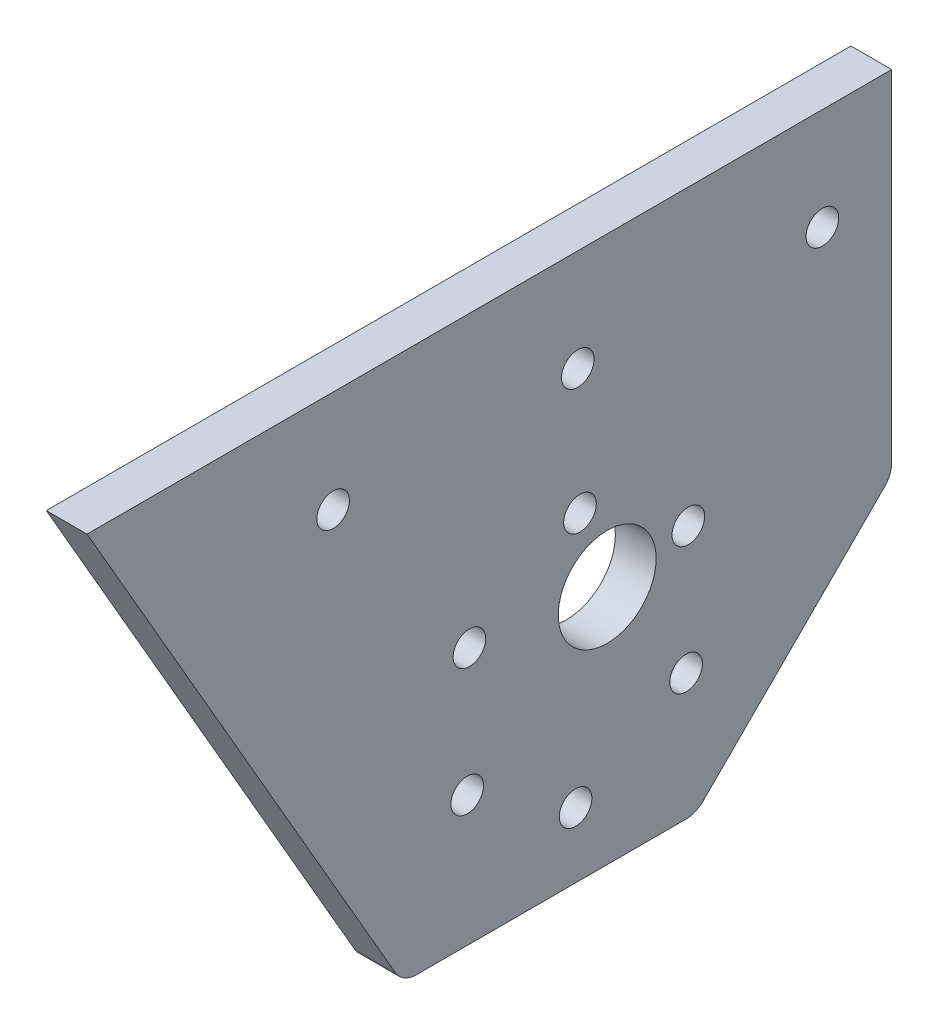
ISO-10303-21;
HEADER;
FILE_DESCRIPTION(('STEP AP214'),'2;1');
FILE_NAME('part.step','',(''),(''),'','','');
FILE_SCHEMA(('AUTOMOTIVE_DESIGN { 1 0 10303 214 1 1 1 1 }'));
ENDSEC;
DATA;
#1=APPLICATION_CONTEXT('core data for automotive mechanical design processes');
#2=APPLICATION_PROTOCOL_DEFINITION('international standard','automotive_design',2000,#1);
#3=PRODUCT_CONTEXT('',#1,'mechanical');
#4=PRODUCT('Part','Part','',(#3));
#5=PRODUCT_RELATED_PRODUCT_CATEGORY('part','',(#4));
#6=PRODUCT_DEFINITION_FORMATION('','',#4);
#7=PRODUCT_DEFINITION_CONTEXT('part definition',#1,'design');
#8=PRODUCT_DEFINITION('design','',#6,#7);
#9=PRODUCT_DEFINITION_SHAPE('','',#8);
#10=(LENGTH_UNIT() NAMED_UNIT(*) SI_UNIT(.MILLI.,.METRE.));
#11=(NAMED_UNIT(*) PLANE_ANGLE_UNIT() SI_UNIT($,.RADIAN.));
#12=(NAMED_UNIT(*) SI_UNIT($,.STERADIAN.) SOLID_ANGLE_UNIT());
#13=UNCERTAINTY_MEASURE_WITH_UNIT(LENGTH_MEASURE(1.E-05),#10,'distance_accuracy_value','');
#14=(GEOMETRIC_REPRESENTATION_CONTEXT(3) GLOBAL_UNCERTAINTY_ASSIGNED_CONTEXT((#13)) GLOBAL_UNIT_ASSIGNED_CONTEXT((#10,
#11,#12)) REPRESENTATION_CONTEXT('',''));
#15=CARTESIAN_POINT('',(0.,0.,0.));
#16=DIRECTION('',(0.,0.,1.));
#17=DIRECTION('',(1.,0.,0.));
#18=AXIS2_PLACEMENT_3D('',#15,#16,#17);
#19=CARTESIAN_POINT('',(5.,-26.5,23.3735004678951));
#20=DIRECTION('',(-1.,0.,0.));
#21=DIRECTION('',(0.,0.,1.));
#22=AXIS2_PLACEMENT_3D('',#19,#20,#21);
#23=PLANE('',#22);
#24=DIRECTION('',(0.,0.,1.));
#25=VECTOR('',#24,1.);
#26=CARTESIAN_POINT('',(5.,37.5,-34.894448724536));
#27=LINE('',#26,#25);
#28=CARTESIAN_POINT('',(5.,37.5,-34.894448724536));
#29=VERTEX_POINT('',#28);
#30=CARTESIAN_POINT('',(5.,37.5,63.7880193111687));
#31=VERTEX_POINT('',#30);
#32=EDGE_CURVE('E151',#29,#31,#27,.T.);
#33=ORIENTED_EDGE('',*,*,#32,.T.);
#34=DIRECTION('',(0.,-0.86602540378444,-0.499999999999998));
#35=VECTOR('',#34,1.);
#36=CARTESIAN_POINT('',(5.,-28.,25.9715766792484));
#37=LINE('',#36,#35);
#38=CARTESIAN_POINT('',(5.,-28.,25.9715766792484));
#39=VERTEX_POINT('',#38);
#40=EDGE_CURVE('E95',#31,#39,#37,.T.);
#41=ORIENTED_EDGE('',*,*,#40,.T.);
#42=CARTESIAN_POINT('',(5.,-26.5,23.3735004678951));
#43=DIRECTION('',(1.,0.,0.));
#44=DIRECTION('',(0.,0.,1.));
#45=AXIS2_PLACEMENT_3D('',#42,#43,#44);
#46=CIRCLE('',#45,3.);
#47=CARTESIAN_POINT('',(5.,-29.5,23.3735004678951));
#48=VERTEX_POINT('',#47);
#49=EDGE_CURVE('E166',#39,#48,#46,.T.);
#50=ORIENTED_EDGE('',*,*,#49,.T.);
#51=DIRECTION('',(0.,0.,-1.));
#52=VECTOR('',#51,1.);
#53=CARTESIAN_POINT('',(5.,-29.5,-9.65180803741673));
#54=LINE('',#53,#52);
#55=CARTESIAN_POINT('',(5.,-29.5,-9.65180803741673));
#56=VERTEX_POINT('',#55);
#57=EDGE_CURVE('E177',#48,#56,#54,.T.);
#58=ORIENTED_EDGE('',*,*,#57,.T.);
#59=CARTESIAN_POINT('',(5.,-26.5,-9.65180803741673));
#60=DIRECTION('',(1.,0.,0.));
#61=DIRECTION('',(0.,0.,1.));
#62=AXIS2_PLACEMENT_3D('',#59,#60,#61);
#63=CIRCLE('',#62,3.);
#64=CARTESIAN_POINT('',(5.,-28.6213203435596,-11.7731283809764));
#65=VERTEX_POINT('',#64);
#66=EDGE_CURVE('E115',#56,#65,#63,.T.);
#67=ORIENTED_EDGE('',*,*,#66,.T.);
#68=DIRECTION('',(0.,0.707106781186548,-0.707106781186548));
#69=VECTOR('',#68,1.);
#70=CARTESIAN_POINT('',(5.,-6.37867965644037,-34.0157690680957));
#71=LINE('',#70,#69);
#72=CARTESIAN_POINT('',(5.,-6.37867965644036,-34.0157690680957));
#73=VERTEX_POINT('',#72);
#74=EDGE_CURVE('E108',#65,#73,#71,.T.);
#75=ORIENTED_EDGE('',*,*,#74,.T.);
#76=CARTESIAN_POINT('',(5.,-4.25735931288073,-31.894448724536));
#77=DIRECTION('',(1.,0.,0.));
#78=DIRECTION('',(0.,0.,1.));
#79=AXIS2_PLACEMENT_3D('',#76,#77,#78);
#80=CIRCLE('',#79,2.99999999999999);
#81=CARTESIAN_POINT('',(5.,-4.25735931288073,-34.894448724536));
#82=VERTEX_POINT('',#81);
#83=EDGE_CURVE('E112',#73,#82,#80,.T.);
#84=ORIENTED_EDGE('',*,*,#83,.T.);
#85=DIRECTION('',(0.,1.,0.));
#86=VECTOR('',#85,1.);
#87=CARTESIAN_POINT('',(5.,36.5555795181046,-34.894448724536));
#88=LINE('',#87,#86);
#89=EDGE_CURVE('E54',#82,#29,#88,.T.);
#90=ORIENTED_EDGE('',*,*,#89,.T.);
#91=EDGE_LOOP('',(#33,#41,#50,#58,#67,#75,#84,#90));
#92=FACE_BOUND('',#91,.T.);
#93=CARTESIAN_POINT('',(5.,0.,0.));
#94=DIRECTION('',(1.,0.,0.));
#95=DIRECTION('',(0.,0.,-1.));
#96=AXIS2_PLACEMENT_3D('',#93,#94,#95);
#97=CIRCLE('',#96,6.);
#98=CARTESIAN_POINT('',(5.,0.,-6.));
#99=VERTEX_POINT('',#98);
#100=EDGE_CURVE('E139',#99,#99,#97,.T.);
#101=ORIENTED_EDGE('',*,*,#100,.F.);
#102=EDGE_LOOP('',(#101));
#103=FACE_BOUND('',#102,.T.);
#104=CARTESIAN_POINT('',(5.,-13.9837206813846,-9.68016301025029));
#105=DIRECTION('',(1.,0.,0.));
#106=DIRECTION('',(0.,0.,-1.));
#107=AXIS2_PLACEMENT_3D('',#104,#105,#106);
#108=CIRCLE('',#107,2.);
#109=CARTESIAN_POINT('',(5.,-13.9837206813846,-11.6801630102503));
#110=VERTEX_POINT('',#109);
#111=EDGE_CURVE('E186',#110,#110,#108,.T.);
#112=ORIENTED_EDGE('',*,*,#111,.F.);
#113=EDGE_LOOP('',(#112));
#114=FACE_BOUND('',#113,.T.);
#115=CARTESIAN_POINT('',(5.,25.,3.60555127546399));
#116=DIRECTION('',(1.,0.,0.));
#117=DIRECTION('',(0.,0.,-1.));
#118=AXIS2_PLACEMENT_3D('',#115,#116,#117);
#119=CIRCLE('',#118,2.);
#120=CARTESIAN_POINT('',(5.,25.,1.60555127546399));
#121=VERTEX_POINT('',#120);
#122=EDGE_CURVE('E192',#121,#121,#119,.T.);
#123=ORIENTED_EDGE('',*,*,#122,.F.);
#124=EDGE_LOOP('',(#123));
#125=FACE_BOUND('',#124,.T.);
#126=CARTESIAN_POINT('',(5.,-21.4976264195427,3.87679905940508));
#127=DIRECTION('',(1.,0.,0.));
#128=DIRECTION('',(0.,0.,-1.));
#129=AXIS2_PLACEMENT_3D('',#126,#127,#128);
#130=CIRCLE('',#129,2.);
#131=CARTESIAN_POINT('',(5.,-21.4976264195427,1.87679905940508));
#132=VERTEX_POINT('',#131);
#133=EDGE_CURVE('E198',#132,#132,#130,.T.);
#134=ORIENTED_EDGE('',*,*,#133,.F.);
#135=EDGE_LOOP('',(#134));
#136=FACE_BOUND('',#135,.T.);
#137=CARTESIAN_POINT('',(5.,-13.5139057381581,17.1625133451194));
#138=DIRECTION('',(1.,0.,0.));
#139=DIRECTION('',(0.,0.,-1.));
#140=AXIS2_PLACEMENT_3D('',#137,#138,#139);
#141=CIRCLE('',#140,2.);
#142=CARTESIAN_POINT('',(5.,-13.5139057381581,15.1625133451194));
#143=VERTEX_POINT('',#142);
#144=EDGE_CURVE('E204',#143,#143,#141,.T.);
#145=ORIENTED_EDGE('',*,*,#144,.F.);
#146=EDGE_LOOP('',(#145));
#147=FACE_BOUND('',#146,.T.);
#148=CARTESIAN_POINT('',(5.,1.98372068138456,16.8912655611783));
#149=DIRECTION('',(1.,0.,0.));
#150=DIRECTION('',(0.,0.,-1.));
#151=AXIS2_PLACEMENT_3D('',#148,#149,#150);
#152=CIRCLE('',#151,2.);
#153=CARTESIAN_POINT('',(5.,1.98372068138456,14.8912655611783));
#154=VERTEX_POINT('',#153);
#155=EDGE_CURVE('E210',#154,#154,#152,.T.);
#156=ORIENTED_EDGE('',*,*,#155,.F.);
#157=EDGE_LOOP('',(#156));
#158=FACE_BOUND('',#157,.T.);
#159=CARTESIAN_POINT('',(5.,9.49762641954267,3.33430349152291));
#160=DIRECTION('',(1.,0.,0.));
#161=DIRECTION('',(0.,0.,-1.));
#162=AXIS2_PLACEMENT_3D('',#159,#160,#161);
#163=CIRCLE('',#162,2.);
#164=CARTESIAN_POINT('',(5.,9.49762641954267,1.33430349152291));
#165=VERTEX_POINT('',#164);
#166=EDGE_CURVE('E216',#165,#165,#163,.T.);
#167=ORIENTED_EDGE('',*,*,#166,.F.);
#168=EDGE_LOOP('',(#167));
#169=FACE_BOUND('',#168,.T.);
#170=CARTESIAN_POINT('',(5.,1.51390573815813,-9.95141079419138));
#171=DIRECTION('',(1.,0.,0.));
#172=DIRECTION('',(0.,0.,-1.));
#173=AXIS2_PLACEMENT_3D('',#170,#171,#172);
#174=CIRCLE('',#173,2.);
#175=CARTESIAN_POINT('',(5.,1.51390573815813,-11.9514107941914));
#176=VERTEX_POINT('',#175);
#177=EDGE_CURVE('E222',#176,#176,#174,.T.);
#178=ORIENTED_EDGE('',*,*,#177,.F.);
#179=EDGE_LOOP('',(#178));
#180=FACE_BOUND('',#179,.T.);
#181=CARTESIAN_POINT('',(5.,25.,-26.394448724536));
#182=DIRECTION('',(1.,0.,0.));
#183=DIRECTION('',(0.,0.,-1.));
#184=AXIS2_PLACEMENT_3D('',#181,#182,#183);
#185=CIRCLE('',#184,2.);
#186=CARTESIAN_POINT('',(5.,25.,-28.394448724536));
#187=VERTEX_POINT('',#186);
#188=EDGE_CURVE('E228',#187,#187,#185,.T.);
#189=ORIENTED_EDGE('',*,*,#188,.F.);
#190=EDGE_LOOP('',(#189));
#191=FACE_BOUND('',#190,.T.);
#192=CARTESIAN_POINT('',(5.,25.,33.605551275464));
#193=DIRECTION('',(1.,0.,0.));
#194=DIRECTION('',(0.,0.,-1.));
#195=AXIS2_PLACEMENT_3D('',#192,#193,#194);
#196=CIRCLE('',#195,2.);
#197=CARTESIAN_POINT('',(5.,25.,31.605551275464));
#198=VERTEX_POINT('',#197);
#199=EDGE_CURVE('E234',#198,#198,#196,.T.);
#200=ORIENTED_EDGE('',*,*,#199,.F.);
#201=EDGE_LOOP('',(#200));
#202=FACE_BOUND('',#201,.T.);
#203=ADVANCED_FACE('F37',(#92,#103,#114,#125,#136,#147,#158,#169,#180,#191,#202),#23,.F.);
#204=CARTESIAN_POINT('',(0.,-26.5,23.3735004678951));
#205=DIRECTION('',(-1.,0.,0.));
#206=DIRECTION('',(0.,0.,1.));
#207=AXIS2_PLACEMENT_3D('',#204,#205,#206);
#208=PLANE('',#207);
#209=CARTESIAN_POINT('',(0.,25.,-26.394448724536));
#210=DIRECTION('',(1.,0.,0.));
#211=DIRECTION('',(0.,0.,-1.));
#212=AXIS2_PLACEMENT_3D('',#209,#210,#211);
#213=CIRCLE('',#212,2.);
#214=CARTESIAN_POINT('',(0.,25.,-28.394448724536));
#215=VERTEX_POINT('',#214);
#216=EDGE_CURVE('E231',#215,#215,#213,.T.);
#217=ORIENTED_EDGE('',*,*,#216,.T.);
#218=EDGE_LOOP('',(#217));
#219=FACE_BOUND('',#218,.T.);
#220=CARTESIAN_POINT('',(0.,9.49762641954267,3.33430349152291));
#221=DIRECTION('',(1.,0.,0.));
#222=DIRECTION('',(0.,0.,-1.));
#223=AXIS2_PLACEMENT_3D('',#220,#221,#222);
#224=CIRCLE('',#223,2.);
#225=CARTESIAN_POINT('',(0.,9.49762641954267,1.33430349152291));
#226=VERTEX_POINT('',#225);
#227=EDGE_CURVE('E219',#226,#226,#224,.T.);
#228=ORIENTED_EDGE('',*,*,#227,.T.);
#229=EDGE_LOOP('',(#228));
#230=FACE_BOUND('',#229,.T.);
#231=CARTESIAN_POINT('',(0.,-13.5139057381581,17.1625133451194));
#232=DIRECTION('',(1.,0.,0.));
#233=DIRECTION('',(0.,0.,-1.));
#234=AXIS2_PLACEMENT_3D('',#231,#232,#233);
#235=CIRCLE('',#234,2.);
#236=CARTESIAN_POINT('',(0.,-13.5139057381581,15.1625133451194));
#237=VERTEX_POINT('',#236);
#238=EDGE_CURVE('E207',#237,#237,#235,.T.);
#239=ORIENTED_EDGE('',*,*,#238,.T.);
#240=EDGE_LOOP('',(#239));
#241=FACE_BOUND('',#240,.T.);
#242=CARTESIAN_POINT('',(0.,25.,3.60555127546399));
#243=DIRECTION('',(1.,0.,0.));
#244=DIRECTION('',(0.,0.,-1.));
#245=AXIS2_PLACEMENT_3D('',#242,#243,#244);
#246=CIRCLE('',#245,2.);
#247=CARTESIAN_POINT('',(0.,25.,1.60555127546399));
#248=VERTEX_POINT('',#247);
#249=EDGE_CURVE('E195',#248,#248,#246,.T.);
#250=ORIENTED_EDGE('',*,*,#249,.T.);
#251=EDGE_LOOP('',(#250));
#252=FACE_BOUND('',#251,.T.);
#253=CARTESIAN_POINT('',(0.,0.,0.));
#254=DIRECTION('',(1.,0.,0.));
#255=DIRECTION('',(0.,0.,-1.));
#256=AXIS2_PLACEMENT_3D('',#253,#254,#255);
#257=CIRCLE('',#256,6.);
#258=CARTESIAN_POINT('',(0.,0.,-6.));
#259=VERTEX_POINT('',#258);
#260=EDGE_CURVE('E183',#259,#259,#257,.T.);
#261=ORIENTED_EDGE('',*,*,#260,.T.);
#262=EDGE_LOOP('',(#261));
#263=FACE_BOUND('',#262,.T.);
#264=DIRECTION('',(0.,0.,1.));
#265=VECTOR('',#264,1.);
#266=CARTESIAN_POINT('',(0.,37.5,-34.894448724536));
#267=LINE('',#266,#265);
#268=CARTESIAN_POINT('',(0.,37.5,-34.894448724536));
#269=VERTEX_POINT('',#268);
#270=CARTESIAN_POINT('',(0.,37.5,63.7880193111687));
#271=VERTEX_POINT('',#270);
#272=EDGE_CURVE('E135',#269,#271,#267,.T.);
#273=ORIENTED_EDGE('',*,*,#272,.F.);
#274=DIRECTION('',(0.,1.,0.));
#275=VECTOR('',#274,1.);
#276=CARTESIAN_POINT('',(0.,36.5555795181046,-34.894448724536));
#277=LINE('',#276,#275);
#278=CARTESIAN_POINT('',(0.,-4.25735931288073,-34.894448724536));
#279=VERTEX_POINT('',#278);
#280=EDGE_CURVE('E83',#279,#269,#277,.T.);
#281=ORIENTED_EDGE('',*,*,#280,.F.);
#282=CARTESIAN_POINT('',(0.,-4.25735931288073,-31.894448724536));
#283=DIRECTION('',(1.,0.,0.));
#284=DIRECTION('',(0.,0.,1.));
#285=AXIS2_PLACEMENT_3D('',#282,#283,#284);
#286=CIRCLE('',#285,2.99999999999999);
#287=CARTESIAN_POINT('',(0.,-6.37867965644036,-34.0157690680957));
#288=VERTEX_POINT('',#287);
#289=EDGE_CURVE('E148',#288,#279,#286,.T.);
#290=ORIENTED_EDGE('',*,*,#289,.F.);
#291=DIRECTION('',(0.,0.707106781186548,-0.707106781186548));
#292=VECTOR('',#291,1.);
#293=CARTESIAN_POINT('',(0.,-6.37867965644037,-34.0157690680957));
#294=LINE('',#293,#292);
#295=CARTESIAN_POINT('',(0.,-28.6213203435596,-11.7731283809764));
#296=VERTEX_POINT('',#295);
#297=EDGE_CURVE('E124',#296,#288,#294,.T.);
#298=ORIENTED_EDGE('',*,*,#297,.F.);
#299=CARTESIAN_POINT('',(0.,-26.5,-9.65180803741673));
#300=DIRECTION('',(1.,0.,0.));
#301=DIRECTION('',(0.,0.,1.));
#302=AXIS2_PLACEMENT_3D('',#299,#300,#301);
#303=CIRCLE('',#302,3.);
#304=CARTESIAN_POINT('',(0.,-29.5,-9.65180803741673));
#305=VERTEX_POINT('',#304);
#306=EDGE_CURVE('E145',#305,#296,#303,.T.);
#307=ORIENTED_EDGE('',*,*,#306,.F.);
#308=DIRECTION('',(0.,0.,-1.));
#309=VECTOR('',#308,1.);
#310=CARTESIAN_POINT('',(0.,-29.5,-9.65180803741673));
#311=LINE('',#310,#309);
#312=CARTESIAN_POINT('',(0.,-29.5,23.3735004678951));
#313=VERTEX_POINT('',#312);
#314=EDGE_CURVE('E143',#313,#305,#311,.T.);
#315=ORIENTED_EDGE('',*,*,#314,.F.);
#316=CARTESIAN_POINT('',(0.,-26.5,23.3735004678951));
#317=DIRECTION('',(1.,0.,0.));
#318=DIRECTION('',(0.,0.,1.));
#319=AXIS2_PLACEMENT_3D('',#316,#317,#318);
#320=CIRCLE('',#319,3.);
#321=CARTESIAN_POINT('',(0.,-28.,25.9715766792484));
#322=VERTEX_POINT('',#321);
#323=EDGE_CURVE('E141',#322,#313,#320,.T.);
#324=ORIENTED_EDGE('',*,*,#323,.F.);
#325=DIRECTION('',(0.,-0.86602540378444,-0.499999999999998));
#326=VECTOR('',#325,1.);
#327=CARTESIAN_POINT('',(0.,-28.,25.9715766792484));
#328=LINE('',#327,#326);
#329=EDGE_CURVE('E138',#271,#322,#328,.T.);
#330=ORIENTED_EDGE('',*,*,#329,.F.);
#331=EDGE_LOOP('',(#273,#281,#290,#298,#307,#315,#324,#330));
#332=FACE_BOUND('',#331,.T.);
#333=CARTESIAN_POINT('',(0.,-13.9837206813846,-9.68016301025029));
#334=DIRECTION('',(1.,0.,0.));
#335=DIRECTION('',(0.,0.,-1.));
#336=AXIS2_PLACEMENT_3D('',#333,#334,#335);
#337=CIRCLE('',#336,2.);
#338=CARTESIAN_POINT('',(0.,-13.9837206813846,-11.6801630102503));
#339=VERTEX_POINT('',#338);
#340=EDGE_CURVE('E189',#339,#339,#337,.T.);
#341=ORIENTED_EDGE('',*,*,#340,.T.);
#342=EDGE_LOOP('',(#341));
#343=FACE_BOUND('',#342,.T.);
#344=CARTESIAN_POINT('',(0.,-21.4976264195427,3.87679905940508));
#345=DIRECTION('',(1.,0.,0.));
#346=DIRECTION('',(0.,0.,-1.));
#347=AXIS2_PLACEMENT_3D('',#344,#345,#346);
#348=CIRCLE('',#347,2.);
#349=CARTESIAN_POINT('',(0.,-21.4976264195427,1.87679905940508));
#350=VERTEX_POINT('',#349);
#351=EDGE_CURVE('E201',#350,#350,#348,.T.);
#352=ORIENTED_EDGE('',*,*,#351,.T.);
#353=EDGE_LOOP('',(#352));
#354=FACE_BOUND('',#353,.T.);
#355=CARTESIAN_POINT('',(0.,1.98372068138456,16.8912655611783));
#356=DIRECTION('',(1.,0.,0.));
#357=DIRECTION('',(0.,0.,-1.));
#358=AXIS2_PLACEMENT_3D('',#355,#356,#357);
#359=CIRCLE('',#358,2.);
#360=CARTESIAN_POINT('',(0.,1.98372068138456,14.8912655611783));
#361=VERTEX_POINT('',#360);
#362=EDGE_CURVE('E213',#361,#361,#359,.T.);
#363=ORIENTED_EDGE('',*,*,#362,.T.);
#364=EDGE_LOOP('',(#363));
#365=FACE_BOUND('',#364,.T.);
#366=CARTESIAN_POINT('',(0.,1.51390573815813,-9.95141079419138));
#367=DIRECTION('',(1.,0.,0.));
#368=DIRECTION('',(0.,0.,-1.));
#369=AXIS2_PLACEMENT_3D('',#366,#367,#368);
#370=CIRCLE('',#369,2.);
#371=CARTESIAN_POINT('',(0.,1.51390573815813,-11.9514107941914));
#372=VERTEX_POINT('',#371);
#373=EDGE_CURVE('E225',#372,#372,#370,.T.);
#374=ORIENTED_EDGE('',*,*,#373,.T.);
#375=EDGE_LOOP('',(#374));
#376=FACE_BOUND('',#375,.T.);
#377=CARTESIAN_POINT('',(0.,25.,33.605551275464));
#378=DIRECTION('',(1.,0.,0.));
#379=DIRECTION('',(0.,0.,-1.));
#380=AXIS2_PLACEMENT_3D('',#377,#378,#379);
#381=CIRCLE('',#380,2.);
#382=CARTESIAN_POINT('',(0.,25.,31.605551275464));
#383=VERTEX_POINT('',#382);
#384=EDGE_CURVE('E237',#383,#383,#381,.T.);
#385=ORIENTED_EDGE('',*,*,#384,.T.);
#386=EDGE_LOOP('',(#385));
#387=FACE_BOUND('',#386,.T.);
#388=ADVANCED_FACE('F168',(#219,#230,#241,#252,#263,#332,#343,#354,#365,#376,#387),#208,.T.);
#389=CARTESIAN_POINT('',(5.,37.5,-34.894448724536));
#390=DIRECTION('',(0.,-1.,0.));
#391=DIRECTION('',(0.,0.,-1.));
#392=AXIS2_PLACEMENT_3D('',#389,#390,#391);
#393=PLANE('',#392);
#394=ORIENTED_EDGE('',*,*,#272,.T.);
#395=DIRECTION('',(-1.,0.,0.));
#396=VECTOR('',#395,1.);
#397=CARTESIAN_POINT('',(5.,37.5,63.7880193111687));
#398=LINE('',#397,#396);
#399=EDGE_CURVE('E11',#31,#271,#398,.T.);
#400=ORIENTED_EDGE('',*,*,#399,.F.);
#401=ORIENTED_EDGE('',*,*,#32,.F.);
#402=DIRECTION('',(-1.,0.,0.));
#403=VECTOR('',#402,1.);
#404=CARTESIAN_POINT('',(5.,37.5,-34.894448724536));
#405=LINE('',#404,#403);
#406=EDGE_CURVE('E131',#29,#269,#405,.T.);
#407=ORIENTED_EDGE('',*,*,#406,.T.);
#408=EDGE_LOOP('',(#394,#400,#401,#407));
#409=FACE_BOUND('',#408,.T.);
#410=ADVANCED_FACE('F39',(#409),#393,.F.);
#411=CARTESIAN_POINT('',(5.,-28.,25.9715766792484));
#412=DIRECTION('',(0.,0.499999999999998,-0.86602540378444));
#413=DIRECTION('',(0.,0.86602540378444,0.499999999999998));
#414=AXIS2_PLACEMENT_3D('',#411,#412,#413);
#415=PLANE('',#414);
#416=ORIENTED_EDGE('',*,*,#329,.T.);
#417=DIRECTION('',(-1.,0.,0.));
#418=VECTOR('',#417,1.);
#419=CARTESIAN_POINT('',(5.,-28.,25.9715766792484));
#420=LINE('',#419,#418);
#421=EDGE_CURVE('E46',#39,#322,#420,.T.);
#422=ORIENTED_EDGE('',*,*,#421,.F.);
#423=ORIENTED_EDGE('',*,*,#40,.F.);
#424=ORIENTED_EDGE('',*,*,#399,.T.);
#425=EDGE_LOOP('',(#416,#422,#423,#424));
#426=FACE_BOUND('',#425,.T.);
#427=ADVANCED_FACE('F269',(#426),#415,.F.);
#428=CARTESIAN_POINT('',(5.,-26.5,23.3735004678951));
#429=DIRECTION('',(-1.,0.,0.));
#430=DIRECTION('',(0.,0.,1.));
#431=AXIS2_PLACEMENT_3D('',#428,#429,#430);
#432=CYLINDRICAL_SURFACE('',#431,3.);
#433=ORIENTED_EDGE('',*,*,#323,.T.);
#434=DIRECTION('',(-1.,0.,0.));
#435=VECTOR('',#434,1.);
#436=CARTESIAN_POINT('',(5.,-29.5,23.3735004678951));
#437=LINE('',#436,#435);
#438=EDGE_CURVE('E158',#48,#313,#437,.T.);
#439=ORIENTED_EDGE('',*,*,#438,.F.);
#440=ORIENTED_EDGE('',*,*,#49,.F.);
#441=ORIENTED_EDGE('',*,*,#421,.T.);
#442=EDGE_LOOP('',(#433,#439,#440,#441));
#443=FACE_BOUND('',#442,.T.);
#444=ADVANCED_FACE('F164',(#443),#432,.T.);
#445=CARTESIAN_POINT('',(5.,-29.5,-9.65180803741673));
#446=DIRECTION('',(0.,1.,0.));
#447=DIRECTION('',(0.,0.,1.));
#448=AXIS2_PLACEMENT_3D('',#445,#446,#447);
#449=PLANE('',#448);
#450=ORIENTED_EDGE('',*,*,#314,.T.);
#451=DIRECTION('',(-1.,0.,0.));
#452=VECTOR('',#451,1.);
#453=CARTESIAN_POINT('',(5.,-29.5,-9.65180803741673));
#454=LINE('',#453,#452);
#455=EDGE_CURVE('E155',#56,#305,#454,.T.);
#456=ORIENTED_EDGE('',*,*,#455,.F.);
#457=ORIENTED_EDGE('',*,*,#57,.F.);
#458=ORIENTED_EDGE('',*,*,#438,.T.);
#459=EDGE_LOOP('',(#450,#456,#457,#458));
#460=FACE_BOUND('',#459,.T.);
#461=ADVANCED_FACE('F173',(#460),#449,.F.);
#462=CARTESIAN_POINT('',(5.,-26.5,-9.65180803741673));
#463=DIRECTION('',(-1.,0.,0.));
#464=DIRECTION('',(0.,0.,1.));
#465=AXIS2_PLACEMENT_3D('',#462,#463,#464);
#466=CYLINDRICAL_SURFACE('',#465,3.);
#467=ORIENTED_EDGE('',*,*,#306,.T.);
#468=DIRECTION('',(-1.,0.,0.));
#469=VECTOR('',#468,1.);
#470=CARTESIAN_POINT('',(5.,-28.6213203435596,-11.7731283809764));
#471=LINE('',#470,#469);
#472=EDGE_CURVE('E126',#65,#296,#471,.T.);
#473=ORIENTED_EDGE('',*,*,#472,.F.);
#474=ORIENTED_EDGE('',*,*,#66,.F.);
#475=ORIENTED_EDGE('',*,*,#455,.T.);
#476=EDGE_LOOP('',(#467,#473,#474,#475));
#477=FACE_BOUND('',#476,.T.);
#478=ADVANCED_FACE('F176',(#477),#466,.T.);
#479=CARTESIAN_POINT('',(5.,-6.37867965644037,-34.0157690680957));
#480=DIRECTION('',(0.,0.707106781186548,0.707106781186548));
#481=DIRECTION('',(0.,-0.707106781186547,0.707106781186548));
#482=AXIS2_PLACEMENT_3D('',#479,#480,#481);
#483=PLANE('',#482);
#484=ORIENTED_EDGE('',*,*,#297,.T.);
#485=DIRECTION('',(-1.,0.,0.));
#486=VECTOR('',#485,1.);
#487=CARTESIAN_POINT('',(5.,-6.37867965644036,-34.0157690680957));
#488=LINE('',#487,#486);
#489=EDGE_CURVE('E121',#73,#288,#488,.T.);
#490=ORIENTED_EDGE('',*,*,#489,.F.);
#491=ORIENTED_EDGE('',*,*,#74,.F.);
#492=ORIENTED_EDGE('',*,*,#472,.T.);
#493=EDGE_LOOP('',(#484,#490,#491,#492));
#494=FACE_BOUND('',#493,.T.);
#495=ADVANCED_FACE('F122',(#494),#483,.F.);
#496=CARTESIAN_POINT('',(5.,-4.25735931288073,-31.894448724536));
#497=DIRECTION('',(-1.,0.,0.));
#498=DIRECTION('',(0.,0.,1.));
#499=AXIS2_PLACEMENT_3D('',#496,#497,#498);
#500=CYLINDRICAL_SURFACE('',#499,2.99999999999999);
#501=ORIENTED_EDGE('',*,*,#289,.T.);
#502=DIRECTION('',(-1.,0.,0.));
#503=VECTOR('',#502,1.);
#504=CARTESIAN_POINT('',(5.,-4.25735931288073,-34.894448724536));
#505=LINE('',#504,#503);
#506=EDGE_CURVE('E127',#82,#279,#505,.T.);
#507=ORIENTED_EDGE('',*,*,#506,.F.);
#508=ORIENTED_EDGE('',*,*,#83,.F.);
#509=ORIENTED_EDGE('',*,*,#489,.T.);
#510=EDGE_LOOP('',(#501,#507,#508,#509));
#511=FACE_BOUND('',#510,.T.);
#512=ADVANCED_FACE('F129',(#511),#500,.T.);
#513=CARTESIAN_POINT('',(5.,36.5555795181046,-34.894448724536));
#514=DIRECTION('',(0.,0.,1.));
#515=DIRECTION('',(0.,-1.,0.));
#516=AXIS2_PLACEMENT_3D('',#513,#514,#515);
#517=PLANE('',#516);
#518=ORIENTED_EDGE('',*,*,#280,.T.);
#519=ORIENTED_EDGE('',*,*,#406,.F.);
#520=ORIENTED_EDGE('',*,*,#89,.F.);
#521=ORIENTED_EDGE('',*,*,#506,.T.);
#522=EDGE_LOOP('',(#518,#519,#520,#521));
#523=FACE_BOUND('',#522,.T.);
#524=ADVANCED_FACE('F257',(#523),#517,.F.);
#525=CARTESIAN_POINT('',(5.,0.,0.));
#526=DIRECTION('',(-1.,0.,0.));
#527=DIRECTION('',(0.,0.,1.));
#528=AXIS2_PLACEMENT_3D('',#525,#526,#527);
#529=CYLINDRICAL_SURFACE('',#528,6.);
#530=ORIENTED_EDGE('',*,*,#100,.T.);
#531=EDGE_LOOP('',(#530));
#532=FACE_BOUND('',#531,.T.);
#533=ORIENTED_EDGE('',*,*,#260,.F.);
#534=EDGE_LOOP('',(#533));
#535=FACE_BOUND('',#534,.T.);
#536=ADVANCED_FACE('F254',(#532,#535),#529,.F.);
#537=CARTESIAN_POINT('',(5.,-13.9837206813846,-9.68016301025029));
#538=DIRECTION('',(-1.,0.,0.));
#539=DIRECTION('',(0.,0.,1.));
#540=AXIS2_PLACEMENT_3D('',#537,#538,#539);
#541=CYLINDRICAL_SURFACE('',#540,2.);
#542=ORIENTED_EDGE('',*,*,#111,.T.);
#543=EDGE_LOOP('',(#542));
#544=FACE_BOUND('',#543,.T.);
#545=ORIENTED_EDGE('',*,*,#340,.F.);
#546=EDGE_LOOP('',(#545));
#547=FACE_BOUND('',#546,.T.);
#548=ADVANCED_FACE('F345',(#544,#547),#541,.F.);
#549=CARTESIAN_POINT('',(5.,25.,3.60555127546399));
#550=DIRECTION('',(-1.,0.,0.));
#551=DIRECTION('',(0.,0.,1.));
#552=AXIS2_PLACEMENT_3D('',#549,#550,#551);
#553=CYLINDRICAL_SURFACE('',#552,2.);
#554=ORIENTED_EDGE('',*,*,#122,.T.);
#555=EDGE_LOOP('',(#554));
#556=FACE_BOUND('',#555,.T.);
#557=ORIENTED_EDGE('',*,*,#249,.F.);
#558=EDGE_LOOP('',(#557));
#559=FACE_BOUND('',#558,.T.);
#560=ADVANCED_FACE('F354',(#556,#559),#553,.F.);
#561=CARTESIAN_POINT('',(5.,-21.4976264195427,3.87679905940508));
#562=DIRECTION('',(-1.,0.,0.));
#563=DIRECTION('',(0.,0.,1.));
#564=AXIS2_PLACEMENT_3D('',#561,#562,#563);
#565=CYLINDRICAL_SURFACE('',#564,2.);
#566=ORIENTED_EDGE('',*,*,#133,.T.);
#567=EDGE_LOOP('',(#566));
#568=FACE_BOUND('',#567,.T.);
#569=ORIENTED_EDGE('',*,*,#351,.F.);
#570=EDGE_LOOP('',(#569));
#571=FACE_BOUND('',#570,.T.);
#572=ADVANCED_FACE('F363',(#568,#571),#565,.F.);
#573=CARTESIAN_POINT('',(5.,-13.5139057381581,17.1625133451194));
#574=DIRECTION('',(-1.,0.,0.));
#575=DIRECTION('',(0.,0.,1.));
#576=AXIS2_PLACEMENT_3D('',#573,#574,#575);
#577=CYLINDRICAL_SURFACE('',#576,2.);
#578=ORIENTED_EDGE('',*,*,#144,.T.);
#579=EDGE_LOOP('',(#578));
#580=FACE_BOUND('',#579,.T.);
#581=ORIENTED_EDGE('',*,*,#238,.F.);
#582=EDGE_LOOP('',(#581));
#583=FACE_BOUND('',#582,.T.);
#584=ADVANCED_FACE('F373',(#580,#583),#577,.F.);
#585=CARTESIAN_POINT('',(5.,1.98372068138456,16.8912655611783));
#586=DIRECTION('',(-1.,0.,0.));
#587=DIRECTION('',(0.,0.,1.));
#588=AXIS2_PLACEMENT_3D('',#585,#586,#587);
#589=CYLINDRICAL_SURFACE('',#588,2.);
#590=ORIENTED_EDGE('',*,*,#155,.T.);
#591=EDGE_LOOP('',(#590));
#592=FACE_BOUND('',#591,.T.);
#593=ORIENTED_EDGE('',*,*,#362,.F.);
#594=EDGE_LOOP('',(#593));
#595=FACE_BOUND('',#594,.T.);
#596=ADVANCED_FACE('F383',(#592,#595),#589,.F.);
#597=CARTESIAN_POINT('',(5.,9.49762641954267,3.33430349152291));
#598=DIRECTION('',(-1.,0.,0.));
#599=DIRECTION('',(0.,0.,1.));
#600=AXIS2_PLACEMENT_3D('',#597,#598,#599);
#601=CYLINDRICAL_SURFACE('',#600,2.);
#602=ORIENTED_EDGE('',*,*,#166,.T.);
#603=EDGE_LOOP('',(#602));
#604=FACE_BOUND('',#603,.T.);
#605=ORIENTED_EDGE('',*,*,#227,.F.);
#606=EDGE_LOOP('',(#605));
#607=FACE_BOUND('',#606,.T.);
#608=ADVANCED_FACE('F393',(#604,#607),#601,.F.);
#609=CARTESIAN_POINT('',(5.,1.51390573815813,-9.95141079419138));
#610=DIRECTION('',(-1.,0.,0.));
#611=DIRECTION('',(0.,0.,1.));
#612=AXIS2_PLACEMENT_3D('',#609,#610,#611);
#613=CYLINDRICAL_SURFACE('',#612,2.);
#614=ORIENTED_EDGE('',*,*,#177,.T.);
#615=EDGE_LOOP('',(#614));
#616=FACE_BOUND('',#615,.T.);
#617=ORIENTED_EDGE('',*,*,#373,.F.);
#618=EDGE_LOOP('',(#617));
#619=FACE_BOUND('',#618,.T.);
#620=ADVANCED_FACE('F403',(#616,#619),#613,.F.);
#621=CARTESIAN_POINT('',(5.,25.,-26.394448724536));
#622=DIRECTION('',(-1.,0.,0.));
#623=DIRECTION('',(0.,0.,1.));
#624=AXIS2_PLACEMENT_3D('',#621,#622,#623);
#625=CYLINDRICAL_SURFACE('',#624,2.);
#626=ORIENTED_EDGE('',*,*,#188,.T.);
#627=EDGE_LOOP('',(#626));
#628=FACE_BOUND('',#627,.T.);
#629=ORIENTED_EDGE('',*,*,#216,.F.);
#630=EDGE_LOOP('',(#629));
#631=FACE_BOUND('',#630,.T.);
#632=ADVANCED_FACE('F413',(#628,#631),#625,.F.);
#633=CARTESIAN_POINT('',(5.,25.,33.605551275464));
#634=DIRECTION('',(-1.,0.,0.));
#635=DIRECTION('',(0.,0.,1.));
#636=AXIS2_PLACEMENT_3D('',#633,#634,#635);
#637=CYLINDRICAL_SURFACE('',#636,2.);
#638=ORIENTED_EDGE('',*,*,#199,.T.);
#639=EDGE_LOOP('',(#638));
#640=FACE_BOUND('',#639,.T.);
#641=ORIENTED_EDGE('',*,*,#384,.F.);
#642=EDGE_LOOP('',(#641));
#643=FACE_BOUND('',#642,.T.);
#644=ADVANCED_FACE('F243',(#640,#643),#637,.F.);
#645=CLOSED_SHELL('',(#203,#388,#410,#427,#444,#461,#478,#495,#512,#524,#536,#548,#560,#572,
#584,#596,#608,#620,#632,#644));
#646=MANIFOLD_SOLID_BREP('B2',#645);
#647=ADVANCED_BREP_SHAPE_REPRESENTATION('',(#18,#646),#14);
#648=SHAPE_DEFINITION_REPRESENTATION(#9,#647);
ENDSEC;
END-ISO-10303-21;
